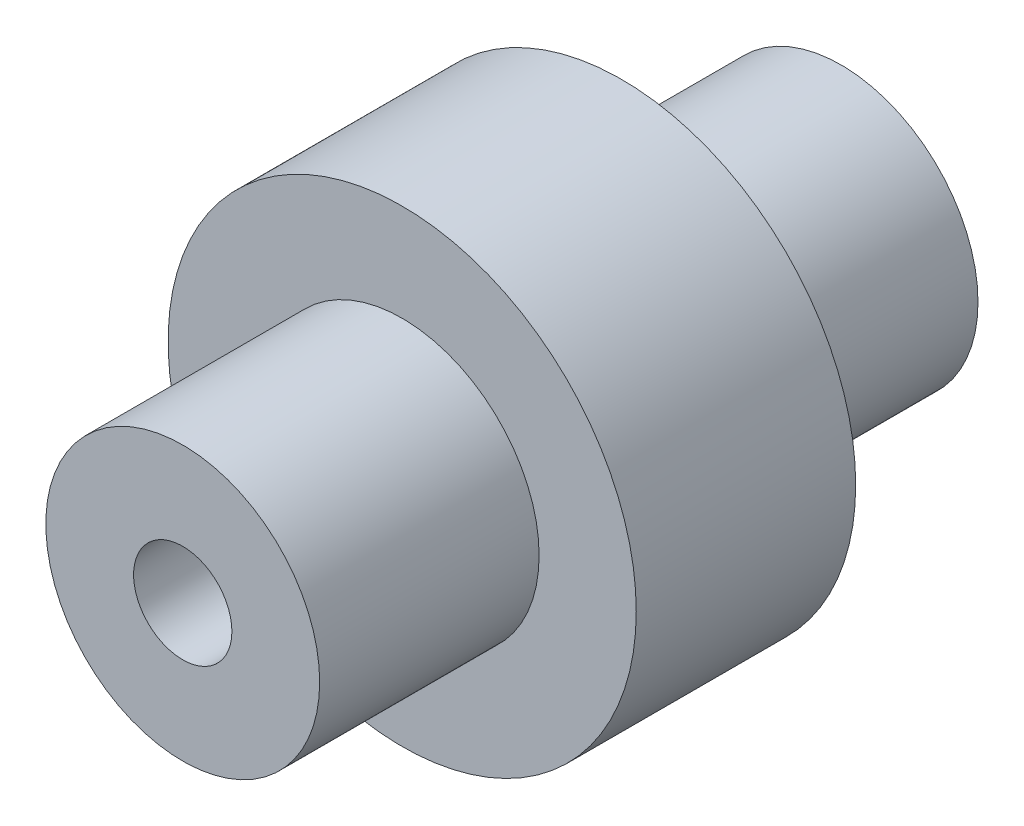
ISO-10303-21;
HEADER;
FILE_DESCRIPTION(('STEP AP214'),'2;1');
FILE_NAME('part.step','',(''),(''),'','','');
FILE_SCHEMA(('AUTOMOTIVE_DESIGN { 1 0 10303 214 1 1 1 1 }'));
ENDSEC;
DATA;
#1=APPLICATION_CONTEXT('core data for automotive mechanical design processes');
#2=APPLICATION_PROTOCOL_DEFINITION('international standard','automotive_design',2000,#1);
#3=PRODUCT_CONTEXT('',#1,'mechanical');
#4=PRODUCT('Part','Part','',(#3));
#5=PRODUCT_RELATED_PRODUCT_CATEGORY('part','',(#4));
#6=PRODUCT_DEFINITION_FORMATION('','',#4);
#7=PRODUCT_DEFINITION_CONTEXT('part definition',#1,'design');
#8=PRODUCT_DEFINITION('design','',#6,#7);
#9=PRODUCT_DEFINITION_SHAPE('','',#8);
#10=(LENGTH_UNIT() NAMED_UNIT(*) SI_UNIT(.MILLI.,.METRE.));
#11=(NAMED_UNIT(*) PLANE_ANGLE_UNIT() SI_UNIT($,.RADIAN.));
#12=(NAMED_UNIT(*) SI_UNIT($,.STERADIAN.) SOLID_ANGLE_UNIT());
#13=UNCERTAINTY_MEASURE_WITH_UNIT(LENGTH_MEASURE(1.E-05),#10,'distance_accuracy_value','');
#14=(GEOMETRIC_REPRESENTATION_CONTEXT(3) GLOBAL_UNCERTAINTY_ASSIGNED_CONTEXT((#13)) GLOBAL_UNIT_ASSIGNED_CONTEXT((#10,
#11,#12)) REPRESENTATION_CONTEXT('',''));
#15=CARTESIAN_POINT('',(0.,0.,0.));
#16=DIRECTION('',(0.,0.,1.));
#17=DIRECTION('',(1.,0.,0.));
#18=AXIS2_PLACEMENT_3D('',#15,#16,#17);
#19=CARTESIAN_POINT('',(0.,0.,9.));
#20=DIRECTION('',(0.,0.,-1.));
#21=DIRECTION('',(-1.,0.,0.));
#22=AXIS2_PLACEMENT_3D('',#19,#20,#21);
#23=CYLINDRICAL_SURFACE('',#22,1.872);
#24=CARTESIAN_POINT('',(0.,0.,0.));
#25=DIRECTION('',(0.,0.,1.));
#26=DIRECTION('',(1.,0.,0.));
#27=AXIS2_PLACEMENT_3D('',#24,#25,#26);
#28=CIRCLE('',#27,1.872);
#29=CARTESIAN_POINT('',(1.872,0.,0.));
#30=VERTEX_POINT('',#29);
#31=EDGE_CURVE('E58',#30,#30,#28,.T.);
#32=ORIENTED_EDGE('',*,*,#31,.T.);
#33=EDGE_LOOP('',(#32));
#34=FACE_BOUND('',#33,.T.);
#35=CARTESIAN_POINT('',(0.,0.,3.));
#36=DIRECTION('',(0.,0.,1.));
#37=DIRECTION('',(1.,0.,0.));
#38=AXIS2_PLACEMENT_3D('',#35,#36,#37);
#39=CIRCLE('',#38,1.872);
#40=CARTESIAN_POINT('',(1.872,0.,3.));
#41=VERTEX_POINT('',#40);
#42=EDGE_CURVE('E10',#41,#41,#39,.T.);
#43=ORIENTED_EDGE('',*,*,#42,.F.);
#44=EDGE_LOOP('',(#43));
#45=FACE_BOUND('',#44,.T.);
#46=ADVANCED_FACE('F45',(#34,#45),#23,.T.);
#47=CARTESIAN_POINT('',(0.,0.,9.));
#48=DIRECTION('',(0.,0.,1.));
#49=DIRECTION('',(1.,0.,0.));
#50=AXIS2_PLACEMENT_3D('',#47,#48,#49);
#51=PLANE('',#50);
#52=CARTESIAN_POINT('',(0.,0.,9.));
#53=DIRECTION('',(0.,0.,1.));
#54=DIRECTION('',(1.,0.,0.));
#55=AXIS2_PLACEMENT_3D('',#52,#53,#54);
#56=CIRCLE('',#55,1.872);
#57=CARTESIAN_POINT('',(1.872,0.,9.));
#58=VERTEX_POINT('',#57);
#59=EDGE_CURVE('E53',#58,#58,#56,.T.);
#60=ORIENTED_EDGE('',*,*,#59,.T.);
#61=EDGE_LOOP('',(#60));
#62=FACE_BOUND('',#61,.T.);
#63=CARTESIAN_POINT('',(0.,0.,9.));
#64=DIRECTION('',(0.,0.,1.));
#65=DIRECTION('',(1.,0.,0.));
#66=AXIS2_PLACEMENT_3D('',#63,#64,#65);
#67=CIRCLE('',#66,0.672);
#68=CARTESIAN_POINT('',(0.672,0.,9.));
#69=VERTEX_POINT('',#68);
#70=EDGE_CURVE('E64',#69,#69,#67,.T.);
#71=ORIENTED_EDGE('',*,*,#70,.F.);
#72=EDGE_LOOP('',(#71));
#73=FACE_BOUND('',#72,.T.);
#74=ADVANCED_FACE('F105',(#62,#73),#51,.T.);
#75=CARTESIAN_POINT('',(0.,0.,0.));
#76=DIRECTION('',(0.,0.,1.));
#77=DIRECTION('',(1.,0.,0.));
#78=AXIS2_PLACEMENT_3D('',#75,#76,#77);
#79=PLANE('',#78);
#80=ORIENTED_EDGE('',*,*,#31,.F.);
#81=EDGE_LOOP('',(#80));
#82=FACE_BOUND('',#81,.T.);
#83=CARTESIAN_POINT('',(0.,0.,0.));
#84=DIRECTION('',(0.,0.,1.));
#85=DIRECTION('',(1.,0.,0.));
#86=AXIS2_PLACEMENT_3D('',#83,#84,#85);
#87=CIRCLE('',#86,0.672);
#88=CARTESIAN_POINT('',(0.672,0.,0.));
#89=VERTEX_POINT('',#88);
#90=EDGE_CURVE('E66',#89,#89,#87,.T.);
#91=ORIENTED_EDGE('',*,*,#90,.T.);
#92=EDGE_LOOP('',(#91));
#93=FACE_BOUND('',#92,.T.);
#94=ADVANCED_FACE('F110',(#82,#93),#79,.F.);
#95=CARTESIAN_POINT('',(0.,0.,6.));
#96=DIRECTION('',(0.,0.,1.));
#97=DIRECTION('',(1.,0.,0.));
#98=AXIS2_PLACEMENT_3D('',#95,#96,#97);
#99=CIRCLE('',#98,1.872);
#100=CARTESIAN_POINT('',(1.872,0.,6.));
#101=VERTEX_POINT('',#100);
#102=EDGE_CURVE('E78',#101,#101,#99,.T.);
#103=ORIENTED_EDGE('',*,*,#102,.T.);
#104=EDGE_LOOP('',(#103));
#105=FACE_BOUND('',#104,.T.);
#106=ORIENTED_EDGE('',*,*,#59,.F.);
#107=EDGE_LOOP('',(#106));
#108=FACE_BOUND('',#107,.T.);
#109=ADVANCED_FACE('F47',(#105,#108),#23,.T.);
#110=CARTESIAN_POINT('',(0.,0.,9.));
#111=DIRECTION('',(0.,0.,-1.));
#112=DIRECTION('',(-1.,0.,0.));
#113=AXIS2_PLACEMENT_3D('',#110,#111,#112);
#114=CYLINDRICAL_SURFACE('',#113,0.672);
#115=ORIENTED_EDGE('',*,*,#70,.T.);
#116=EDGE_LOOP('',(#115));
#117=FACE_BOUND('',#116,.T.);
#118=ORIENTED_EDGE('',*,*,#90,.F.);
#119=EDGE_LOOP('',(#118));
#120=FACE_BOUND('',#119,.T.);
#121=ADVANCED_FACE('F91',(#117,#120),#114,.F.);
#122=CARTESIAN_POINT('',(0.,0.,6.));
#123=DIRECTION('',(0.,0.,1.));
#124=DIRECTION('',(1.,0.,0.));
#125=AXIS2_PLACEMENT_3D('',#122,#123,#124);
#126=PLANE('',#125);
#127=CARTESIAN_POINT('',(0.,0.,6.));
#128=DIRECTION('',(0.,0.,1.));
#129=DIRECTION('',(1.,0.,0.));
#130=AXIS2_PLACEMENT_3D('',#127,#128,#129);
#131=CIRCLE('',#130,3.2);
#132=CARTESIAN_POINT('',(3.2,0.,6.));
#133=VERTEX_POINT('',#132);
#134=EDGE_CURVE('E70',#133,#133,#131,.T.);
#135=ORIENTED_EDGE('',*,*,#134,.T.);
#136=EDGE_LOOP('',(#135));
#137=FACE_BOUND('',#136,.T.);
#138=ORIENTED_EDGE('',*,*,#102,.F.);
#139=EDGE_LOOP('',(#138));
#140=FACE_BOUND('',#139,.T.);
#141=ADVANCED_FACE('F88',(#137,#140),#126,.T.);
#142=CARTESIAN_POINT('',(0.,0.,3.));
#143=DIRECTION('',(0.,0.,1.));
#144=DIRECTION('',(1.,0.,0.));
#145=AXIS2_PLACEMENT_3D('',#142,#143,#144);
#146=PLANE('',#145);
#147=CARTESIAN_POINT('',(0.,0.,3.));
#148=DIRECTION('',(0.,0.,1.));
#149=DIRECTION('',(1.,0.,0.));
#150=AXIS2_PLACEMENT_3D('',#147,#148,#149);
#151=CIRCLE('',#150,3.2);
#152=CARTESIAN_POINT('',(3.2,0.,3.));
#153=VERTEX_POINT('',#152);
#154=EDGE_CURVE('E74',#153,#153,#151,.T.);
#155=ORIENTED_EDGE('',*,*,#154,.F.);
#156=EDGE_LOOP('',(#155));
#157=FACE_BOUND('',#156,.T.);
#158=ORIENTED_EDGE('',*,*,#42,.T.);
#159=EDGE_LOOP('',(#158));
#160=FACE_BOUND('',#159,.T.);
#161=ADVANCED_FACE('F90',(#157,#160),#146,.F.);
#162=CARTESIAN_POINT('',(0.,0.,6.));
#163=DIRECTION('',(0.,0.,-1.));
#164=DIRECTION('',(-1.,0.,0.));
#165=AXIS2_PLACEMENT_3D('',#162,#163,#164);
#166=CYLINDRICAL_SURFACE('',#165,3.2);
#167=ORIENTED_EDGE('',*,*,#134,.F.);
#168=EDGE_LOOP('',(#167));
#169=FACE_BOUND('',#168,.T.);
#170=ORIENTED_EDGE('',*,*,#154,.T.);
#171=EDGE_LOOP('',(#170));
#172=FACE_BOUND('',#171,.T.);
#173=ADVANCED_FACE('F98',(#169,#172),#166,.T.);
#174=CLOSED_SHELL('',(#46,#74,#94,#109,#121,#141,#161,#173));
#175=MANIFOLD_SOLID_BREP('B2',#174);
#176=ADVANCED_BREP_SHAPE_REPRESENTATION('',(#18,#175),#14);
#177=SHAPE_DEFINITION_REPRESENTATION(#9,#176);
ENDSEC;
END-ISO-10303-21;
